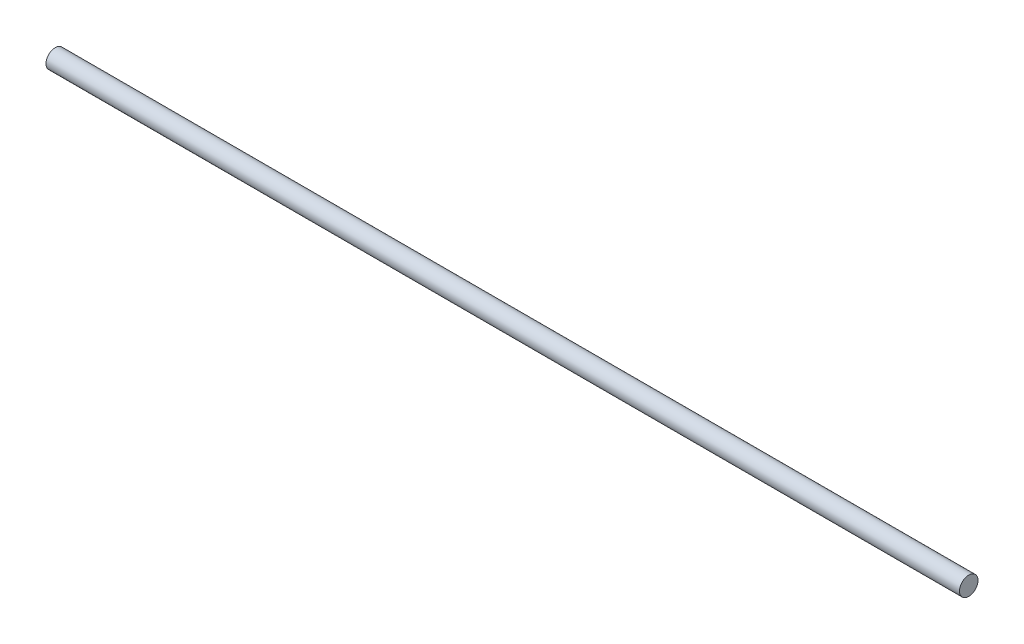
ISO-10303-21;
HEADER;
FILE_DESCRIPTION(('STEP AP214'),'2;1');
FILE_NAME('part.step','',(''),(''),'','','');
FILE_SCHEMA(('AUTOMOTIVE_DESIGN { 1 0 10303 214 1 1 1 1 }'));
ENDSEC;
DATA;
#1=APPLICATION_CONTEXT('core data for automotive mechanical design processes');
#2=APPLICATION_PROTOCOL_DEFINITION('international standard','automotive_design',2000,#1);
#3=PRODUCT_CONTEXT('',#1,'mechanical');
#4=PRODUCT('Part','Part','',(#3));
#5=PRODUCT_RELATED_PRODUCT_CATEGORY('part','',(#4));
#6=PRODUCT_DEFINITION_FORMATION('','',#4);
#7=PRODUCT_DEFINITION_CONTEXT('part definition',#1,'design');
#8=PRODUCT_DEFINITION('design','',#6,#7);
#9=PRODUCT_DEFINITION_SHAPE('','',#8);
#10=(LENGTH_UNIT() NAMED_UNIT(*) SI_UNIT(.MILLI.,.METRE.));
#11=(NAMED_UNIT(*) PLANE_ANGLE_UNIT() SI_UNIT($,.RADIAN.));
#12=(NAMED_UNIT(*) SI_UNIT($,.STERADIAN.) SOLID_ANGLE_UNIT());
#13=UNCERTAINTY_MEASURE_WITH_UNIT(LENGTH_MEASURE(1.E-05),#10,'distance_accuracy_value','');
#14=(GEOMETRIC_REPRESENTATION_CONTEXT(3) GLOBAL_UNCERTAINTY_ASSIGNED_CONTEXT((#13)) GLOBAL_UNIT_ASSIGNED_CONTEXT((#10,
#11,#12)) REPRESENTATION_CONTEXT('',''));
#15=CARTESIAN_POINT('',(0.,0.,0.));
#16=DIRECTION('',(0.,0.,1.));
#17=DIRECTION('',(1.,0.,0.));
#18=AXIS2_PLACEMENT_3D('',#15,#16,#17);
#19=CARTESIAN_POINT('',(400.,0.,0.));
#20=DIRECTION('',(-1.,0.,0.));
#21=DIRECTION('',(0.,0.,1.));
#22=AXIS2_PLACEMENT_3D('',#19,#20,#21);
#23=CYLINDRICAL_SURFACE('',#22,4.05);
#24=CARTESIAN_POINT('',(400.,0.,0.));
#25=DIRECTION('',(1.,0.,0.));
#26=DIRECTION('',(0.,0.,-1.));
#27=AXIS2_PLACEMENT_3D('',#24,#25,#26);
#28=CIRCLE('',#27,4.05);
#29=CARTESIAN_POINT('',(400.,0.,-4.05));
#30=VERTEX_POINT('',#29);
#31=EDGE_CURVE('E10',#30,#30,#28,.T.);
#32=ORIENTED_EDGE('',*,*,#31,.F.);
#33=EDGE_LOOP('',(#32));
#34=FACE_BOUND('',#33,.T.);
#35=CARTESIAN_POINT('',(0.,0.,0.));
#36=DIRECTION('',(1.,0.,0.));
#37=DIRECTION('',(0.,0.,-1.));
#38=AXIS2_PLACEMENT_3D('',#35,#36,#37);
#39=CIRCLE('',#38,4.05);
#40=CARTESIAN_POINT('',(0.,0.,-4.05));
#41=VERTEX_POINT('',#40);
#42=EDGE_CURVE('E36',#41,#41,#39,.T.);
#43=ORIENTED_EDGE('',*,*,#42,.T.);
#44=EDGE_LOOP('',(#43));
#45=FACE_BOUND('',#44,.T.);
#46=ADVANCED_FACE('F33',(#34,#45),#23,.T.);
#47=CARTESIAN_POINT('',(400.,0.,0.));
#48=DIRECTION('',(1.,0.,0.));
#49=DIRECTION('',(0.,0.,-1.));
#50=AXIS2_PLACEMENT_3D('',#47,#48,#49);
#51=PLANE('',#50);
#52=ORIENTED_EDGE('',*,*,#31,.T.);
#53=EDGE_LOOP('',(#52));
#54=FACE_BOUND('',#53,.T.);
#55=ADVANCED_FACE('F48',(#54),#51,.T.);
#56=CARTESIAN_POINT('',(0.,0.,0.));
#57=DIRECTION('',(1.,0.,0.));
#58=DIRECTION('',(0.,0.,-1.));
#59=AXIS2_PLACEMENT_3D('',#56,#57,#58);
#60=PLANE('',#59);
#61=ORIENTED_EDGE('',*,*,#42,.F.);
#62=EDGE_LOOP('',(#61));
#63=FACE_BOUND('',#62,.T.);
#64=ADVANCED_FACE('F46',(#63),#60,.F.);
#65=CLOSED_SHELL('',(#46,#55,#64));
#66=MANIFOLD_SOLID_BREP('B2',#65);
#67=ADVANCED_BREP_SHAPE_REPRESENTATION('',(#18,#66),#14);
#68=SHAPE_DEFINITION_REPRESENTATION(#9,#67);
ENDSEC;
END-ISO-10303-21;
